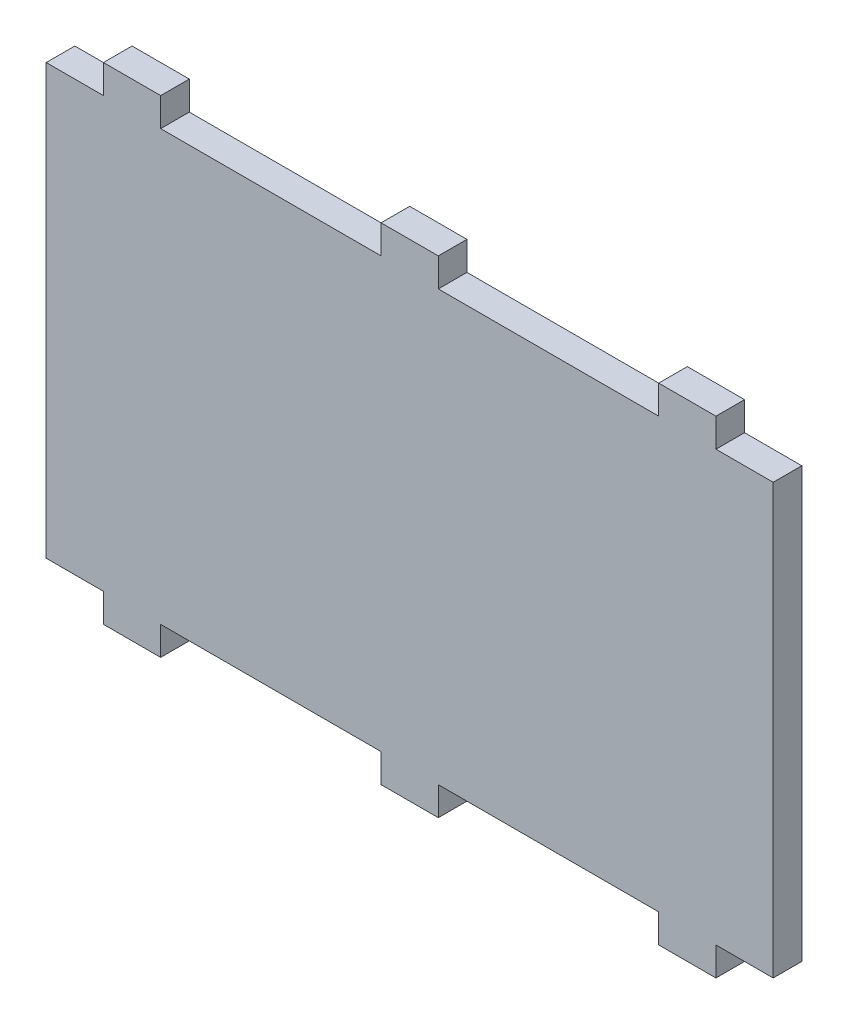
ISO-10303-21;
HEADER;
FILE_DESCRIPTION(('STEP AP214'),'2;1');
FILE_NAME('part.step','',(''),(''),'','','');
FILE_SCHEMA(('AUTOMOTIVE_DESIGN { 1 0 10303 214 1 1 1 1 }'));
ENDSEC;
DATA;
#1=APPLICATION_CONTEXT('core data for automotive mechanical design processes');
#2=APPLICATION_PROTOCOL_DEFINITION('international standard','automotive_design',2000,#1);
#3=PRODUCT_CONTEXT('',#1,'mechanical');
#4=PRODUCT('Part','Part','',(#3));
#5=PRODUCT_RELATED_PRODUCT_CATEGORY('part','',(#4));
#6=PRODUCT_DEFINITION_FORMATION('','',#4);
#7=PRODUCT_DEFINITION_CONTEXT('part definition',#1,'design');
#8=PRODUCT_DEFINITION('design','',#6,#7);
#9=PRODUCT_DEFINITION_SHAPE('','',#8);
#10=(LENGTH_UNIT() NAMED_UNIT(*) SI_UNIT(.MILLI.,.METRE.));
#11=(NAMED_UNIT(*) PLANE_ANGLE_UNIT() SI_UNIT($,.RADIAN.));
#12=(NAMED_UNIT(*) SI_UNIT($,.STERADIAN.) SOLID_ANGLE_UNIT());
#13=UNCERTAINTY_MEASURE_WITH_UNIT(LENGTH_MEASURE(1.E-05),#10,'distance_accuracy_value','');
#14=(GEOMETRIC_REPRESENTATION_CONTEXT(3) GLOBAL_UNCERTAINTY_ASSIGNED_CONTEXT((#13)) GLOBAL_UNIT_ASSIGNED_CONTEXT((#10,
#11,#12)) REPRESENTATION_CONTEXT('',''));
#15=CARTESIAN_POINT('',(0.,0.,0.));
#16=DIRECTION('',(0.,0.,1.));
#17=DIRECTION('',(1.,0.,0.));
#18=AXIS2_PLACEMENT_3D('',#15,#16,#17);
#19=CARTESIAN_POINT('',(0.,0.,5.));
#20=DIRECTION('',(0.,1.,0.));
#21=DIRECTION('',(0.,0.,1.));
#22=AXIS2_PLACEMENT_3D('',#19,#20,#21);
#23=PLANE('',#22);
#24=DIRECTION('',(1.,0.,0.));
#25=VECTOR('',#24,1.);
#26=CARTESIAN_POINT('',(0.,0.,0.));
#27=LINE('',#26,#25);
#28=CARTESIAN_POINT('',(68.5,0.,0.));
#29=VERTEX_POINT('',#28);
#30=CARTESIAN_POINT('',(107.,0.,0.));
#31=VERTEX_POINT('',#30);
#32=EDGE_CURVE('E320',#29,#31,#27,.T.);
#33=ORIENTED_EDGE('',*,*,#32,.T.);
#34=DIRECTION('',(0.,0.,1.));
#35=VECTOR('',#34,1.);
#36=CARTESIAN_POINT('',(107.,0.,0.));
#37=LINE('',#36,#35);
#38=CARTESIAN_POINT('',(107.,0.,5.));
#39=VERTEX_POINT('',#38);
#40=EDGE_CURVE('E58',#31,#39,#37,.T.);
#41=ORIENTED_EDGE('',*,*,#40,.T.);
#42=DIRECTION('',(1.,0.,0.));
#43=VECTOR('',#42,1.);
#44=CARTESIAN_POINT('',(0.,0.,5.));
#45=LINE('',#44,#43);
#46=CARTESIAN_POINT('',(68.5,0.,5.));
#47=VERTEX_POINT('',#46);
#48=EDGE_CURVE('E325',#47,#39,#45,.T.);
#49=ORIENTED_EDGE('',*,*,#48,.F.);
#50=DIRECTION('',(0.,0.,1.));
#51=VECTOR('',#50,1.);
#52=CARTESIAN_POINT('',(68.5,0.,0.));
#53=LINE('',#52,#51);
#54=EDGE_CURVE('E278',#29,#47,#53,.T.);
#55=ORIENTED_EDGE('',*,*,#54,.F.);
#56=EDGE_LOOP('',(#33,#41,#49,#55));
#57=FACE_BOUND('',#56,.T.);
#58=ADVANCED_FACE('F33',(#57),#23,.F.);
#59=CARTESIAN_POINT('',(20.,0.,0.));
#60=VERTEX_POINT('',#59);
#61=CARTESIAN_POINT('',(58.5,0.,0.));
#62=VERTEX_POINT('',#61);
#63=EDGE_CURVE('E323',#60,#62,#27,.T.);
#64=ORIENTED_EDGE('',*,*,#63,.T.);
#65=DIRECTION('',(0.,0.,1.));
#66=VECTOR('',#65,1.);
#67=CARTESIAN_POINT('',(58.5,0.,0.));
#68=LINE('',#67,#66);
#69=CARTESIAN_POINT('',(58.5,0.,5.));
#70=VERTEX_POINT('',#69);
#71=EDGE_CURVE('E275',#62,#70,#68,.T.);
#72=ORIENTED_EDGE('',*,*,#71,.T.);
#73=CARTESIAN_POINT('',(20.,0.,5.));
#74=VERTEX_POINT('',#73);
#75=EDGE_CURVE('E737',#74,#70,#45,.T.);
#76=ORIENTED_EDGE('',*,*,#75,.F.);
#77=DIRECTION('',(0.,0.,1.));
#78=VECTOR('',#77,1.);
#79=CARTESIAN_POINT('',(20.,0.,0.));
#80=LINE('',#79,#78);
#81=EDGE_CURVE('E303',#60,#74,#80,.T.);
#82=ORIENTED_EDGE('',*,*,#81,.F.);
#83=EDGE_LOOP('',(#64,#72,#76,#82));
#84=FACE_BOUND('',#83,.T.);
#85=ADVANCED_FACE('F496',(#84),#23,.F.);
#86=CARTESIAN_POINT('',(117.,0.,5.));
#87=VERTEX_POINT('',#86);
#88=CARTESIAN_POINT('',(127.,0.,5.));
#89=VERTEX_POINT('',#88);
#90=EDGE_CURVE('E37',#87,#89,#45,.T.);
#91=ORIENTED_EDGE('',*,*,#90,.F.);
#92=DIRECTION('',(0.,0.,1.));
#93=VECTOR('',#92,1.);
#94=CARTESIAN_POINT('',(117.,0.,0.));
#95=LINE('',#94,#93);
#96=CARTESIAN_POINT('',(117.,0.,0.));
#97=VERTEX_POINT('',#96);
#98=EDGE_CURVE('E254',#97,#87,#95,.T.);
#99=ORIENTED_EDGE('',*,*,#98,.F.);
#100=CARTESIAN_POINT('',(127.,0.,0.));
#101=VERTEX_POINT('',#100);
#102=EDGE_CURVE('E324',#97,#101,#27,.T.);
#103=ORIENTED_EDGE('',*,*,#102,.T.);
#104=DIRECTION('',(0.,0.,-1.));
#105=VECTOR('',#104,1.);
#106=CARTESIAN_POINT('',(127.,0.,5.));
#107=LINE('',#106,#105);
#108=EDGE_CURVE('E43',#89,#101,#107,.T.);
#109=ORIENTED_EDGE('',*,*,#108,.F.);
#110=EDGE_LOOP('',(#91,#99,#103,#109));
#111=FACE_BOUND('',#110,.T.);
#112=ADVANCED_FACE('F491',(#111),#23,.F.);
#113=CARTESIAN_POINT('',(0.,75.,5.));
#114=DIRECTION('',(0.,-1.,0.));
#115=DIRECTION('',(0.,0.,-1.));
#116=AXIS2_PLACEMENT_3D('',#113,#114,#115);
#117=PLANE('',#116);
#118=DIRECTION('',(-1.,0.,0.));
#119=VECTOR('',#118,1.);
#120=CARTESIAN_POINT('',(0.,75.,5.));
#121=LINE('',#120,#119);
#122=CARTESIAN_POINT('',(58.5,75.,5.));
#123=VERTEX_POINT('',#122);
#124=CARTESIAN_POINT('',(20.,75.,5.));
#125=VERTEX_POINT('',#124);
#126=EDGE_CURVE('E342',#123,#125,#121,.T.);
#127=ORIENTED_EDGE('',*,*,#126,.F.);
#128=DIRECTION('',(0.,0.,1.));
#129=VECTOR('',#128,1.);
#130=CARTESIAN_POINT('',(58.5,75.,0.));
#131=LINE('',#130,#129);
#132=CARTESIAN_POINT('',(58.5,75.,0.));
#133=VERTEX_POINT('',#132);
#134=EDGE_CURVE('E766',#133,#123,#131,.T.);
#135=ORIENTED_EDGE('',*,*,#134,.F.);
#136=DIRECTION('',(-1.,0.,0.));
#137=VECTOR('',#136,1.);
#138=CARTESIAN_POINT('',(0.,75.,0.));
#139=LINE('',#138,#137);
#140=CARTESIAN_POINT('',(20.,75.,0.));
#141=VERTEX_POINT('',#140);
#142=EDGE_CURVE('E346',#133,#141,#139,.T.);
#143=ORIENTED_EDGE('',*,*,#142,.T.);
#144=DIRECTION('',(0.,0.,1.));
#145=VECTOR('',#144,1.);
#146=CARTESIAN_POINT('',(20.,75.,0.));
#147=LINE('',#146,#145);
#148=EDGE_CURVE('E442',#141,#125,#147,.T.);
#149=ORIENTED_EDGE('',*,*,#148,.T.);
#150=EDGE_LOOP('',(#127,#135,#143,#149));
#151=FACE_BOUND('',#150,.T.);
#152=ADVANCED_FACE('F484',(#151),#117,.F.);
#153=CARTESIAN_POINT('',(127.,75.,0.));
#154=VERTEX_POINT('',#153);
#155=CARTESIAN_POINT('',(117.,75.,0.));
#156=VERTEX_POINT('',#155);
#157=EDGE_CURVE('E363',#154,#156,#139,.T.);
#158=ORIENTED_EDGE('',*,*,#157,.T.);
#159=DIRECTION('',(0.,0.,1.));
#160=VECTOR('',#159,1.);
#161=CARTESIAN_POINT('',(117.,75.,0.));
#162=LINE('',#161,#160);
#163=CARTESIAN_POINT('',(117.,75.,5.));
#164=VERTEX_POINT('',#163);
#165=EDGE_CURVE('E402',#156,#164,#162,.T.);
#166=ORIENTED_EDGE('',*,*,#165,.T.);
#167=CARTESIAN_POINT('',(127.,75.,5.));
#168=VERTEX_POINT('',#167);
#169=EDGE_CURVE('E357',#168,#164,#121,.T.);
#170=ORIENTED_EDGE('',*,*,#169,.F.);
#171=DIRECTION('',(0.,0.,-1.));
#172=VECTOR('',#171,1.);
#173=CARTESIAN_POINT('',(127.,75.,5.));
#174=LINE('',#173,#172);
#175=EDGE_CURVE('E378',#168,#154,#174,.T.);
#176=ORIENTED_EDGE('',*,*,#175,.T.);
#177=EDGE_LOOP('',(#158,#166,#170,#176));
#178=FACE_BOUND('',#177,.T.);
#179=ADVANCED_FACE('F482',(#178),#117,.F.);
#180=DIRECTION('',(0.,0.,1.));
#181=VECTOR('',#180,1.);
#182=CARTESIAN_POINT('',(9.99999999999999,75.,0.));
#183=LINE('',#182,#181);
#184=CARTESIAN_POINT('',(9.99999999999999,75.,0.));
#185=VERTEX_POINT('',#184);
#186=CARTESIAN_POINT('',(9.99999999999999,75.,5.));
#187=VERTEX_POINT('',#186);
#188=EDGE_CURVE('E431',#185,#187,#183,.T.);
#189=ORIENTED_EDGE('',*,*,#188,.F.);
#190=CARTESIAN_POINT('',(0.,75.,0.));
#191=VERTEX_POINT('',#190);
#192=EDGE_CURVE('E372',#185,#191,#139,.T.);
#193=ORIENTED_EDGE('',*,*,#192,.T.);
#194=DIRECTION('',(0.,0.,-1.));
#195=VECTOR('',#194,1.);
#196=CARTESIAN_POINT('',(0.,75.,5.));
#197=LINE('',#196,#195);
#198=CARTESIAN_POINT('',(0.,75.,5.));
#199=VERTEX_POINT('',#198);
#200=EDGE_CURVE('E368',#199,#191,#197,.T.);
#201=ORIENTED_EDGE('',*,*,#200,.F.);
#202=EDGE_CURVE('E345',#187,#199,#121,.T.);
#203=ORIENTED_EDGE('',*,*,#202,.F.);
#204=EDGE_LOOP('',(#189,#193,#201,#203));
#205=FACE_BOUND('',#204,.T.);
#206=ADVANCED_FACE('F477',(#205),#117,.F.);
#207=CARTESIAN_POINT('',(0.,0.,5.));
#208=DIRECTION('',(1.,0.,0.));
#209=DIRECTION('',(0.,0.,-1.));
#210=AXIS2_PLACEMENT_3D('',#207,#208,#209);
#211=PLANE('',#210);
#212=DIRECTION('',(0.,-1.,0.));
#213=VECTOR('',#212,1.);
#214=CARTESIAN_POINT('',(0.,0.,0.));
#215=LINE('',#214,#213);
#216=CARTESIAN_POINT('',(0.,0.,0.));
#217=VERTEX_POINT('',#216);
#218=EDGE_CURVE('E329',#191,#217,#215,.T.);
#219=ORIENTED_EDGE('',*,*,#218,.T.);
#220=DIRECTION('',(0.,0.,-1.));
#221=VECTOR('',#220,1.);
#222=CARTESIAN_POINT('',(0.,0.,5.));
#223=LINE('',#222,#221);
#224=CARTESIAN_POINT('',(0.,0.,5.));
#225=VERTEX_POINT('',#224);
#226=EDGE_CURVE('E11',#225,#217,#223,.T.);
#227=ORIENTED_EDGE('',*,*,#226,.F.);
#228=DIRECTION('',(0.,-1.,0.));
#229=VECTOR('',#228,1.);
#230=CARTESIAN_POINT('',(0.,0.,5.));
#231=LINE('',#230,#229);
#232=EDGE_CURVE('E375',#199,#225,#231,.T.);
#233=ORIENTED_EDGE('',*,*,#232,.F.);
#234=ORIENTED_EDGE('',*,*,#200,.T.);
#235=EDGE_LOOP('',(#219,#227,#233,#234));
#236=FACE_BOUND('',#235,.T.);
#237=ADVANCED_FACE('F35',(#236),#211,.F.);
#238=CARTESIAN_POINT('',(10.,0.,0.));
#239=VERTEX_POINT('',#238);
#240=EDGE_CURVE('E339',#217,#239,#27,.T.);
#241=ORIENTED_EDGE('',*,*,#240,.T.);
#242=DIRECTION('',(0.,0.,1.));
#243=VECTOR('',#242,1.);
#244=CARTESIAN_POINT('',(10.,0.,0.));
#245=LINE('',#244,#243);
#246=CARTESIAN_POINT('',(10.,0.,5.));
#247=VERTEX_POINT('',#246);
#248=EDGE_CURVE('E298',#239,#247,#245,.T.);
#249=ORIENTED_EDGE('',*,*,#248,.T.);
#250=EDGE_CURVE('E739',#225,#247,#45,.T.);
#251=ORIENTED_EDGE('',*,*,#250,.F.);
#252=ORIENTED_EDGE('',*,*,#226,.T.);
#253=EDGE_LOOP('',(#241,#249,#251,#252));
#254=FACE_BOUND('',#253,.T.);
#255=ADVANCED_FACE('F497',(#254),#23,.F.);
#256=CARTESIAN_POINT('',(127.,0.,5.));
#257=DIRECTION('',(-1.,0.,0.));
#258=DIRECTION('',(0.,0.,1.));
#259=AXIS2_PLACEMENT_3D('',#256,#257,#258);
#260=PLANE('',#259);
#261=DIRECTION('',(0.,1.,0.));
#262=VECTOR('',#261,1.);
#263=CARTESIAN_POINT('',(127.,0.,0.));
#264=LINE('',#263,#262);
#265=EDGE_CURVE('E331',#101,#154,#264,.T.);
#266=ORIENTED_EDGE('',*,*,#265,.T.);
#267=ORIENTED_EDGE('',*,*,#175,.F.);
#268=DIRECTION('',(0.,1.,0.));
#269=VECTOR('',#268,1.);
#270=CARTESIAN_POINT('',(127.,0.,5.));
#271=LINE('',#270,#269);
#272=EDGE_CURVE('E350',#89,#168,#271,.T.);
#273=ORIENTED_EDGE('',*,*,#272,.F.);
#274=ORIENTED_EDGE('',*,*,#108,.T.);
#275=EDGE_LOOP('',(#266,#267,#273,#274));
#276=FACE_BOUND('',#275,.T.);
#277=ADVANCED_FACE('F480',(#276),#260,.F.);
#278=CARTESIAN_POINT('',(107.,75.,0.));
#279=VERTEX_POINT('',#278);
#280=CARTESIAN_POINT('',(68.5,75.,0.));
#281=VERTEX_POINT('',#280);
#282=EDGE_CURVE('E361',#279,#281,#139,.T.);
#283=ORIENTED_EDGE('',*,*,#282,.T.);
#284=DIRECTION('',(0.,0.,1.));
#285=VECTOR('',#284,1.);
#286=CARTESIAN_POINT('',(68.5,75.,0.));
#287=LINE('',#286,#285);
#288=CARTESIAN_POINT('',(68.5,75.,5.));
#289=VERTEX_POINT('',#288);
#290=EDGE_CURVE('E774',#281,#289,#287,.T.);
#291=ORIENTED_EDGE('',*,*,#290,.T.);
#292=CARTESIAN_POINT('',(107.,75.,5.));
#293=VERTEX_POINT('',#292);
#294=EDGE_CURVE('E344',#293,#289,#121,.T.);
#295=ORIENTED_EDGE('',*,*,#294,.F.);
#296=DIRECTION('',(0.,0.,1.));
#297=VECTOR('',#296,1.);
#298=CARTESIAN_POINT('',(107.,75.,0.));
#299=LINE('',#298,#297);
#300=EDGE_CURVE('E422',#279,#293,#299,.T.);
#301=ORIENTED_EDGE('',*,*,#300,.F.);
#302=EDGE_LOOP('',(#283,#291,#295,#301));
#303=FACE_BOUND('',#302,.T.);
#304=ADVANCED_FACE('F490',(#303),#117,.F.);
#305=CARTESIAN_POINT('',(0.,0.,5.));
#306=DIRECTION('',(0.,0.,-1.));
#307=DIRECTION('',(-1.,0.,0.));
#308=AXIS2_PLACEMENT_3D('',#305,#306,#307);
#309=PLANE('',#308);
#310=ORIENTED_EDGE('',*,*,#232,.T.);
#311=ORIENTED_EDGE('',*,*,#250,.T.);
#312=DIRECTION('',(0.,-1.,0.));
#313=VECTOR('',#312,1.);
#314=CARTESIAN_POINT('',(10.,0.,5.));
#315=LINE('',#314,#313);
#316=CARTESIAN_POINT('',(10.,-5.,5.));
#317=VERTEX_POINT('',#316);
#318=EDGE_CURVE('E277',#247,#317,#315,.T.);
#319=ORIENTED_EDGE('',*,*,#318,.T.);
#320=DIRECTION('',(1.,0.,0.));
#321=VECTOR('',#320,1.);
#322=CARTESIAN_POINT('',(10.,-5.,5.));
#323=LINE('',#322,#321);
#324=CARTESIAN_POINT('',(20.,-5.,5.));
#325=VERTEX_POINT('',#324);
#326=EDGE_CURVE('E289',#317,#325,#323,.T.);
#327=ORIENTED_EDGE('',*,*,#326,.T.);
#328=DIRECTION('',(0.,1.,0.));
#329=VECTOR('',#328,1.);
#330=CARTESIAN_POINT('',(20.,0.,5.));
#331=LINE('',#330,#329);
#332=EDGE_CURVE('E292',#325,#74,#331,.T.);
#333=ORIENTED_EDGE('',*,*,#332,.T.);
#334=ORIENTED_EDGE('',*,*,#75,.T.);
#335=DIRECTION('',(0.,-1.,0.));
#336=VECTOR('',#335,1.);
#337=CARTESIAN_POINT('',(58.5,0.,5.));
#338=LINE('',#337,#336);
#339=CARTESIAN_POINT('',(58.5,-5.,5.));
#340=VERTEX_POINT('',#339);
#341=EDGE_CURVE('E253',#70,#340,#338,.T.);
#342=ORIENTED_EDGE('',*,*,#341,.T.);
#343=DIRECTION('',(1.,0.,0.));
#344=VECTOR('',#343,1.);
#345=CARTESIAN_POINT('',(58.5,-5.,5.));
#346=LINE('',#345,#344);
#347=CARTESIAN_POINT('',(68.5,-5.,5.));
#348=VERTEX_POINT('',#347);
#349=EDGE_CURVE('E270',#340,#348,#346,.T.);
#350=ORIENTED_EDGE('',*,*,#349,.T.);
#351=DIRECTION('',(0.,1.,0.));
#352=VECTOR('',#351,1.);
#353=CARTESIAN_POINT('',(68.5,0.,5.));
#354=LINE('',#353,#352);
#355=EDGE_CURVE('E261',#348,#47,#354,.T.);
#356=ORIENTED_EDGE('',*,*,#355,.T.);
#357=ORIENTED_EDGE('',*,*,#48,.T.);
#358=DIRECTION('',(0.,-1.,0.));
#359=VECTOR('',#358,1.);
#360=CARTESIAN_POINT('',(107.,0.,5.));
#361=LINE('',#360,#359);
#362=CARTESIAN_POINT('',(107.,-5.00000000000001,5.));
#363=VERTEX_POINT('',#362);
#364=EDGE_CURVE('E249',#39,#363,#361,.T.);
#365=ORIENTED_EDGE('',*,*,#364,.T.);
#366=DIRECTION('',(1.,0.,0.));
#367=VECTOR('',#366,1.);
#368=CARTESIAN_POINT('',(107.,-5.00000000000001,5.));
#369=LINE('',#368,#367);
#370=CARTESIAN_POINT('',(117.,-5.00000000000001,5.));
#371=VERTEX_POINT('',#370);
#372=EDGE_CURVE('E226',#363,#371,#369,.T.);
#373=ORIENTED_EDGE('',*,*,#372,.T.);
#374=DIRECTION('',(0.,1.,0.));
#375=VECTOR('',#374,1.);
#376=CARTESIAN_POINT('',(117.,0.,5.));
#377=LINE('',#376,#375);
#378=EDGE_CURVE('E243',#371,#87,#377,.T.);
#379=ORIENTED_EDGE('',*,*,#378,.T.);
#380=ORIENTED_EDGE('',*,*,#90,.T.);
#381=ORIENTED_EDGE('',*,*,#272,.T.);
#382=ORIENTED_EDGE('',*,*,#169,.T.);
#383=DIRECTION('',(0.,1.,0.));
#384=VECTOR('',#383,1.);
#385=CARTESIAN_POINT('',(117.,75.,5.));
#386=LINE('',#385,#384);
#387=CARTESIAN_POINT('',(117.,80.,5.));
#388=VERTEX_POINT('',#387);
#389=EDGE_CURVE('E396',#164,#388,#386,.T.);
#390=ORIENTED_EDGE('',*,*,#389,.T.);
#391=DIRECTION('',(-1.,0.,0.));
#392=VECTOR('',#391,1.);
#393=CARTESIAN_POINT('',(117.,80.,5.));
#394=LINE('',#393,#392);
#395=CARTESIAN_POINT('',(107.,80.,5.));
#396=VERTEX_POINT('',#395);
#397=EDGE_CURVE('E406',#388,#396,#394,.T.);
#398=ORIENTED_EDGE('',*,*,#397,.T.);
#399=DIRECTION('',(0.,-1.,0.));
#400=VECTOR('',#399,1.);
#401=CARTESIAN_POINT('',(107.,75.,5.));
#402=LINE('',#401,#400);
#403=EDGE_CURVE('E409',#396,#293,#402,.T.);
#404=ORIENTED_EDGE('',*,*,#403,.T.);
#405=ORIENTED_EDGE('',*,*,#294,.T.);
#406=DIRECTION('',(0.,1.,0.));
#407=VECTOR('',#406,1.);
#408=CARTESIAN_POINT('',(68.5,75.,5.));
#409=LINE('',#408,#407);
#410=CARTESIAN_POINT('',(68.5,80.,5.));
#411=VERTEX_POINT('',#410);
#412=EDGE_CURVE('E768',#289,#411,#409,.T.);
#413=ORIENTED_EDGE('',*,*,#412,.T.);
#414=DIRECTION('',(-1.,0.,0.));
#415=VECTOR('',#414,1.);
#416=CARTESIAN_POINT('',(58.5,80.,5.));
#417=LINE('',#416,#415);
#418=CARTESIAN_POINT('',(58.5,80.,5.));
#419=VERTEX_POINT('',#418);
#420=EDGE_CURVE('E760',#411,#419,#417,.T.);
#421=ORIENTED_EDGE('',*,*,#420,.T.);
#422=DIRECTION('',(0.,-1.,0.));
#423=VECTOR('',#422,1.);
#424=CARTESIAN_POINT('',(58.5,75.,5.));
#425=LINE('',#424,#423);
#426=EDGE_CURVE('E302',#419,#123,#425,.T.);
#427=ORIENTED_EDGE('',*,*,#426,.T.);
#428=ORIENTED_EDGE('',*,*,#126,.T.);
#429=DIRECTION('',(0.,1.,0.));
#430=VECTOR('',#429,1.);
#431=CARTESIAN_POINT('',(20.,75.,5.));
#432=LINE('',#431,#430);
#433=CARTESIAN_POINT('',(20.,80.,5.));
#434=VERTEX_POINT('',#433);
#435=EDGE_CURVE('E437',#125,#434,#432,.T.);
#436=ORIENTED_EDGE('',*,*,#435,.T.);
#437=DIRECTION('',(-1.,0.,0.));
#438=VECTOR('',#437,1.);
#439=CARTESIAN_POINT('',(10.,80.,5.));
#440=LINE('',#439,#438);
#441=CARTESIAN_POINT('',(10.,80.,5.));
#442=VERTEX_POINT('',#441);
#443=EDGE_CURVE('E433',#434,#442,#440,.T.);
#444=ORIENTED_EDGE('',*,*,#443,.T.);
#445=DIRECTION('',(0.,-1.,0.));
#446=VECTOR('',#445,1.);
#447=CARTESIAN_POINT('',(9.99999999999999,75.,5.));
#448=LINE('',#447,#446);
#449=EDGE_CURVE('E421',#442,#187,#448,.T.);
#450=ORIENTED_EDGE('',*,*,#449,.T.);
#451=ORIENTED_EDGE('',*,*,#202,.T.);
#452=EDGE_LOOP('',(#310,#311,#319,#327,#333,#334,#342,#350,#356,#357,#365,#373,#379,#380,#381,
#382,#390,#398,#404,#405,#413,#421,#427,#428,#436,#444,#450,#451));
#453=FACE_BOUND('',#452,.T.);
#454=ADVANCED_FACE('F394',(#453),#309,.F.);
#455=CARTESIAN_POINT('',(0.,0.,0.));
#456=DIRECTION('',(0.,0.,-1.));
#457=DIRECTION('',(-1.,0.,0.));
#458=AXIS2_PLACEMENT_3D('',#455,#456,#457);
#459=PLANE('',#458);
#460=ORIENTED_EDGE('',*,*,#218,.F.);
#461=ORIENTED_EDGE('',*,*,#192,.F.);
#462=DIRECTION('',(0.,-1.,0.));
#463=VECTOR('',#462,1.);
#464=CARTESIAN_POINT('',(9.99999999999999,75.,0.));
#465=LINE('',#464,#463);
#466=CARTESIAN_POINT('',(10.,80.,0.));
#467=VERTEX_POINT('',#466);
#468=EDGE_CURVE('E436',#467,#185,#465,.T.);
#469=ORIENTED_EDGE('',*,*,#468,.F.);
#470=DIRECTION('',(-1.,0.,0.));
#471=VECTOR('',#470,1.);
#472=CARTESIAN_POINT('',(10.,80.,0.));
#473=LINE('',#472,#471);
#474=CARTESIAN_POINT('',(20.,80.,0.));
#475=VERTEX_POINT('',#474);
#476=EDGE_CURVE('E428',#475,#467,#473,.T.);
#477=ORIENTED_EDGE('',*,*,#476,.F.);
#478=DIRECTION('',(0.,1.,0.));
#479=VECTOR('',#478,1.);
#480=CARTESIAN_POINT('',(20.,75.,0.));
#481=LINE('',#480,#479);
#482=EDGE_CURVE('E432',#141,#475,#481,.T.);
#483=ORIENTED_EDGE('',*,*,#482,.F.);
#484=ORIENTED_EDGE('',*,*,#142,.F.);
#485=DIRECTION('',(0.,-1.,0.));
#486=VECTOR('',#485,1.);
#487=CARTESIAN_POINT('',(58.5,75.,0.));
#488=LINE('',#487,#486);
#489=CARTESIAN_POINT('',(58.5,80.,0.));
#490=VERTEX_POINT('',#489);
#491=EDGE_CURVE('E756',#490,#133,#488,.T.);
#492=ORIENTED_EDGE('',*,*,#491,.F.);
#493=DIRECTION('',(-1.,0.,0.));
#494=VECTOR('',#493,1.);
#495=CARTESIAN_POINT('',(58.5,80.,0.));
#496=LINE('',#495,#494);
#497=CARTESIAN_POINT('',(68.5,80.,0.));
#498=VERTEX_POINT('',#497);
#499=EDGE_CURVE('E763',#498,#490,#496,.T.);
#500=ORIENTED_EDGE('',*,*,#499,.F.);
#501=DIRECTION('',(0.,1.,0.));
#502=VECTOR('',#501,1.);
#503=CARTESIAN_POINT('',(68.5,75.,0.));
#504=LINE('',#503,#502);
#505=EDGE_CURVE('E759',#281,#498,#504,.T.);
#506=ORIENTED_EDGE('',*,*,#505,.F.);
#507=ORIENTED_EDGE('',*,*,#282,.F.);
#508=DIRECTION('',(0.,-1.,0.));
#509=VECTOR('',#508,1.);
#510=CARTESIAN_POINT('',(107.,75.,0.));
#511=LINE('',#510,#509);
#512=CARTESIAN_POINT('',(107.,80.,0.));
#513=VERTEX_POINT('',#512);
#514=EDGE_CURVE('E414',#513,#279,#511,.T.);
#515=ORIENTED_EDGE('',*,*,#514,.F.);
#516=DIRECTION('',(-1.,0.,0.));
#517=VECTOR('',#516,1.);
#518=CARTESIAN_POINT('',(117.,80.,0.));
#519=LINE('',#518,#517);
#520=CARTESIAN_POINT('',(117.,80.,0.));
#521=VERTEX_POINT('',#520);
#522=EDGE_CURVE('E778',#521,#513,#519,.T.);
#523=ORIENTED_EDGE('',*,*,#522,.F.);
#524=DIRECTION('',(0.,1.,0.));
#525=VECTOR('',#524,1.);
#526=CARTESIAN_POINT('',(117.,75.,0.));
#527=LINE('',#526,#525);
#528=EDGE_CURVE('E419',#156,#521,#527,.T.);
#529=ORIENTED_EDGE('',*,*,#528,.F.);
#530=ORIENTED_EDGE('',*,*,#157,.F.);
#531=ORIENTED_EDGE('',*,*,#265,.F.);
#532=ORIENTED_EDGE('',*,*,#102,.F.);
#533=DIRECTION('',(0.,1.,0.));
#534=VECTOR('',#533,1.);
#535=CARTESIAN_POINT('',(117.,0.,0.));
#536=LINE('',#535,#534);
#537=CARTESIAN_POINT('',(117.,-5.00000000000001,0.));
#538=VERTEX_POINT('',#537);
#539=EDGE_CURVE('E232',#538,#97,#536,.T.);
#540=ORIENTED_EDGE('',*,*,#539,.F.);
#541=DIRECTION('',(1.,0.,0.));
#542=VECTOR('',#541,1.);
#543=CARTESIAN_POINT('',(107.,-5.00000000000001,0.));
#544=LINE('',#543,#542);
#545=CARTESIAN_POINT('',(107.,-5.00000000000001,0.));
#546=VERTEX_POINT('',#545);
#547=EDGE_CURVE('E224',#546,#538,#544,.T.);
#548=ORIENTED_EDGE('',*,*,#547,.F.);
#549=DIRECTION('',(0.,-1.,0.));
#550=VECTOR('',#549,1.);
#551=CARTESIAN_POINT('',(107.,0.,0.));
#552=LINE('',#551,#550);
#553=EDGE_CURVE('E239',#31,#546,#552,.T.);
#554=ORIENTED_EDGE('',*,*,#553,.F.);
#555=ORIENTED_EDGE('',*,*,#32,.F.);
#556=DIRECTION('',(0.,1.,0.));
#557=VECTOR('',#556,1.);
#558=CARTESIAN_POINT('',(68.5,0.,0.));
#559=LINE('',#558,#557);
#560=CARTESIAN_POINT('',(68.5,-5.,0.));
#561=VERTEX_POINT('',#560);
#562=EDGE_CURVE('E264',#561,#29,#559,.T.);
#563=ORIENTED_EDGE('',*,*,#562,.F.);
#564=DIRECTION('',(1.,0.,0.));
#565=VECTOR('',#564,1.);
#566=CARTESIAN_POINT('',(58.5,-5.,0.));
#567=LINE('',#566,#565);
#568=CARTESIAN_POINT('',(58.5,-5.,0.));
#569=VERTEX_POINT('',#568);
#570=EDGE_CURVE('E260',#569,#561,#567,.T.);
#571=ORIENTED_EDGE('',*,*,#570,.F.);
#572=DIRECTION('',(0.,-1.,0.));
#573=VECTOR('',#572,1.);
#574=CARTESIAN_POINT('',(58.5,0.,0.));
#575=LINE('',#574,#573);
#576=EDGE_CURVE('E257',#62,#569,#575,.T.);
#577=ORIENTED_EDGE('',*,*,#576,.F.);
#578=ORIENTED_EDGE('',*,*,#63,.F.);
#579=DIRECTION('',(0.,1.,0.));
#580=VECTOR('',#579,1.);
#581=CARTESIAN_POINT('',(20.,0.,0.));
#582=LINE('',#581,#580);
#583=CARTESIAN_POINT('',(20.,-5.,0.));
#584=VERTEX_POINT('',#583);
#585=EDGE_CURVE('E287',#584,#60,#582,.T.);
#586=ORIENTED_EDGE('',*,*,#585,.F.);
#587=DIRECTION('',(1.,0.,0.));
#588=VECTOR('',#587,1.);
#589=CARTESIAN_POINT('',(10.,-5.,0.));
#590=LINE('',#589,#588);
#591=CARTESIAN_POINT('',(10.,-5.,0.));
#592=VERTEX_POINT('',#591);
#593=EDGE_CURVE('E284',#592,#584,#590,.T.);
#594=ORIENTED_EDGE('',*,*,#593,.F.);
#595=DIRECTION('',(0.,-1.,0.));
#596=VECTOR('',#595,1.);
#597=CARTESIAN_POINT('',(10.,0.,0.));
#598=LINE('',#597,#596);
#599=EDGE_CURVE('E288',#239,#592,#598,.T.);
#600=ORIENTED_EDGE('',*,*,#599,.F.);
#601=ORIENTED_EDGE('',*,*,#240,.F.);
#602=EDGE_LOOP('',(#460,#461,#469,#477,#483,#484,#492,#500,#506,#507,#515,#523,#529,#530,#531,
#532,#540,#548,#554,#555,#563,#571,#577,#578,#586,#594,#600,#601));
#603=FACE_BOUND('',#602,.T.);
#604=ADVANCED_FACE('F238',(#603),#459,.T.);
#605=CARTESIAN_POINT('',(9.99999999999999,75.,0.));
#606=DIRECTION('',(-1.,0.,0.));
#607=DIRECTION('',(0.,-1.,0.));
#608=AXIS2_PLACEMENT_3D('',#605,#606,#607);
#609=PLANE('',#608);
#610=ORIENTED_EDGE('',*,*,#449,.F.);
#611=DIRECTION('',(0.,0.,1.));
#612=VECTOR('',#611,1.);
#613=CARTESIAN_POINT('',(10.,80.,0.));
#614=LINE('',#613,#612);
#615=EDGE_CURVE('E438',#467,#442,#614,.T.);
#616=ORIENTED_EDGE('',*,*,#615,.F.);
#617=ORIENTED_EDGE('',*,*,#468,.T.);
#618=ORIENTED_EDGE('',*,*,#188,.T.);
#619=EDGE_LOOP('',(#610,#616,#617,#618));
#620=FACE_BOUND('',#619,.T.);
#621=ADVANCED_FACE('F473',(#620),#609,.T.);
#622=CARTESIAN_POINT('',(10.,80.,0.));
#623=DIRECTION('',(0.,1.,0.));
#624=DIRECTION('',(0.,0.,1.));
#625=AXIS2_PLACEMENT_3D('',#622,#623,#624);
#626=PLANE('',#625);
#627=ORIENTED_EDGE('',*,*,#443,.F.);
#628=DIRECTION('',(0.,0.,1.));
#629=VECTOR('',#628,1.);
#630=CARTESIAN_POINT('',(20.,80.,0.));
#631=LINE('',#630,#629);
#632=EDGE_CURVE('E440',#475,#434,#631,.T.);
#633=ORIENTED_EDGE('',*,*,#632,.F.);
#634=ORIENTED_EDGE('',*,*,#476,.T.);
#635=ORIENTED_EDGE('',*,*,#615,.T.);
#636=EDGE_LOOP('',(#627,#633,#634,#635));
#637=FACE_BOUND('',#636,.T.);
#638=ADVANCED_FACE('F469',(#637),#626,.T.);
#639=CARTESIAN_POINT('',(20.,75.,0.));
#640=DIRECTION('',(1.,0.,0.));
#641=DIRECTION('',(0.,0.,-1.));
#642=AXIS2_PLACEMENT_3D('',#639,#640,#641);
#643=PLANE('',#642);
#644=ORIENTED_EDGE('',*,*,#435,.F.);
#645=ORIENTED_EDGE('',*,*,#148,.F.);
#646=ORIENTED_EDGE('',*,*,#482,.T.);
#647=ORIENTED_EDGE('',*,*,#632,.T.);
#648=EDGE_LOOP('',(#644,#645,#646,#647));
#649=FACE_BOUND('',#648,.T.);
#650=ADVANCED_FACE('F578',(#649),#643,.T.);
#651=CARTESIAN_POINT('',(117.,75.,0.));
#652=DIRECTION('',(1.,0.,0.));
#653=DIRECTION('',(0.,0.,-1.));
#654=AXIS2_PLACEMENT_3D('',#651,#652,#653);
#655=PLANE('',#654);
#656=ORIENTED_EDGE('',*,*,#389,.F.);
#657=ORIENTED_EDGE('',*,*,#165,.F.);
#658=ORIENTED_EDGE('',*,*,#528,.T.);
#659=DIRECTION('',(0.,0.,1.));
#660=VECTOR('',#659,1.);
#661=CARTESIAN_POINT('',(117.,80.,0.));
#662=LINE('',#661,#660);
#663=EDGE_CURVE('E404',#521,#388,#662,.T.);
#664=ORIENTED_EDGE('',*,*,#663,.T.);
#665=EDGE_LOOP('',(#656,#657,#658,#664));
#666=FACE_BOUND('',#665,.T.);
#667=ADVANCED_FACE('F400',(#666),#655,.T.);
#668=CARTESIAN_POINT('',(107.,75.,0.));
#669=DIRECTION('',(-1.,0.,0.));
#670=DIRECTION('',(0.,0.,1.));
#671=AXIS2_PLACEMENT_3D('',#668,#669,#670);
#672=PLANE('',#671);
#673=ORIENTED_EDGE('',*,*,#403,.F.);
#674=DIRECTION('',(0.,0.,1.));
#675=VECTOR('',#674,1.);
#676=CARTESIAN_POINT('',(107.,80.,0.));
#677=LINE('',#676,#675);
#678=EDGE_CURVE('E425',#513,#396,#677,.T.);
#679=ORIENTED_EDGE('',*,*,#678,.F.);
#680=ORIENTED_EDGE('',*,*,#514,.T.);
#681=ORIENTED_EDGE('',*,*,#300,.T.);
#682=EDGE_LOOP('',(#673,#679,#680,#681));
#683=FACE_BOUND('',#682,.T.);
#684=ADVANCED_FACE('F595',(#683),#672,.T.);
#685=CARTESIAN_POINT('',(117.,80.,0.));
#686=DIRECTION('',(0.,1.,0.));
#687=DIRECTION('',(0.,0.,1.));
#688=AXIS2_PLACEMENT_3D('',#685,#686,#687);
#689=PLANE('',#688);
#690=ORIENTED_EDGE('',*,*,#397,.F.);
#691=ORIENTED_EDGE('',*,*,#663,.F.);
#692=ORIENTED_EDGE('',*,*,#522,.T.);
#693=ORIENTED_EDGE('',*,*,#678,.T.);
#694=EDGE_LOOP('',(#690,#691,#692,#693));
#695=FACE_BOUND('',#694,.T.);
#696=ADVANCED_FACE('F604',(#695),#689,.T.);
#697=CARTESIAN_POINT('',(58.5,75.,0.));
#698=DIRECTION('',(-1.,0.,0.));
#699=DIRECTION('',(0.,0.,1.));
#700=AXIS2_PLACEMENT_3D('',#697,#698,#699);
#701=PLANE('',#700);
#702=ORIENTED_EDGE('',*,*,#426,.F.);
#703=DIRECTION('',(0.,0.,1.));
#704=VECTOR('',#703,1.);
#705=CARTESIAN_POINT('',(58.5,80.,0.));
#706=LINE('',#705,#704);
#707=EDGE_CURVE('E407',#490,#419,#706,.T.);
#708=ORIENTED_EDGE('',*,*,#707,.F.);
#709=ORIENTED_EDGE('',*,*,#491,.T.);
#710=ORIENTED_EDGE('',*,*,#134,.T.);
#711=EDGE_LOOP('',(#702,#708,#709,#710));
#712=FACE_BOUND('',#711,.T.);
#713=ADVANCED_FACE('F614',(#712),#701,.T.);
#714=CARTESIAN_POINT('',(58.5,80.,0.));
#715=DIRECTION('',(0.,1.,0.));
#716=DIRECTION('',(0.,0.,1.));
#717=AXIS2_PLACEMENT_3D('',#714,#715,#716);
#718=PLANE('',#717);
#719=ORIENTED_EDGE('',*,*,#420,.F.);
#720=DIRECTION('',(0.,0.,1.));
#721=VECTOR('',#720,1.);
#722=CARTESIAN_POINT('',(68.5,80.,0.));
#723=LINE('',#722,#721);
#724=EDGE_CURVE('E411',#498,#411,#723,.T.);
#725=ORIENTED_EDGE('',*,*,#724,.F.);
#726=ORIENTED_EDGE('',*,*,#499,.T.);
#727=ORIENTED_EDGE('',*,*,#707,.T.);
#728=EDGE_LOOP('',(#719,#725,#726,#727));
#729=FACE_BOUND('',#728,.T.);
#730=ADVANCED_FACE('F624',(#729),#718,.T.);
#731=CARTESIAN_POINT('',(68.5,75.,0.));
#732=DIRECTION('',(1.,0.,0.));
#733=DIRECTION('',(0.,0.,-1.));
#734=AXIS2_PLACEMENT_3D('',#731,#732,#733);
#735=PLANE('',#734);
#736=ORIENTED_EDGE('',*,*,#412,.F.);
#737=ORIENTED_EDGE('',*,*,#290,.F.);
#738=ORIENTED_EDGE('',*,*,#505,.T.);
#739=ORIENTED_EDGE('',*,*,#724,.T.);
#740=EDGE_LOOP('',(#736,#737,#738,#739));
#741=FACE_BOUND('',#740,.T.);
#742=ADVANCED_FACE('F634',(#741),#735,.T.);
#743=CARTESIAN_POINT('',(10.,0.,0.));
#744=DIRECTION('',(-1.,0.,0.));
#745=DIRECTION('',(0.,-1.,0.));
#746=AXIS2_PLACEMENT_3D('',#743,#744,#745);
#747=PLANE('',#746);
#748=ORIENTED_EDGE('',*,*,#318,.F.);
#749=ORIENTED_EDGE('',*,*,#248,.F.);
#750=ORIENTED_EDGE('',*,*,#599,.T.);
#751=DIRECTION('',(0.,0.,1.));
#752=VECTOR('',#751,1.);
#753=CARTESIAN_POINT('',(10.,-5.,0.));
#754=LINE('',#753,#752);
#755=EDGE_CURVE('E313',#592,#317,#754,.T.);
#756=ORIENTED_EDGE('',*,*,#755,.T.);
#757=EDGE_LOOP('',(#748,#749,#750,#756));
#758=FACE_BOUND('',#757,.T.);
#759=ADVANCED_FACE('F644',(#758),#747,.T.);
#760=CARTESIAN_POINT('',(20.,0.,0.));
#761=DIRECTION('',(1.,0.,0.));
#762=DIRECTION('',(0.,0.,-1.));
#763=AXIS2_PLACEMENT_3D('',#760,#761,#762);
#764=PLANE('',#763);
#765=ORIENTED_EDGE('',*,*,#332,.F.);
#766=DIRECTION('',(0.,0.,1.));
#767=VECTOR('',#766,1.);
#768=CARTESIAN_POINT('',(20.,-5.,0.));
#769=LINE('',#768,#767);
#770=EDGE_CURVE('E311',#584,#325,#769,.T.);
#771=ORIENTED_EDGE('',*,*,#770,.F.);
#772=ORIENTED_EDGE('',*,*,#585,.T.);
#773=ORIENTED_EDGE('',*,*,#81,.T.);
#774=EDGE_LOOP('',(#765,#771,#772,#773));
#775=FACE_BOUND('',#774,.T.);
#776=ADVANCED_FACE('F654',(#775),#764,.T.);
#777=CARTESIAN_POINT('',(10.,-5.,0.));
#778=DIRECTION('',(0.,-1.,0.));
#779=DIRECTION('',(0.,0.,-1.));
#780=AXIS2_PLACEMENT_3D('',#777,#778,#779);
#781=PLANE('',#780);
#782=ORIENTED_EDGE('',*,*,#326,.F.);
#783=ORIENTED_EDGE('',*,*,#755,.F.);
#784=ORIENTED_EDGE('',*,*,#593,.T.);
#785=ORIENTED_EDGE('',*,*,#770,.T.);
#786=EDGE_LOOP('',(#782,#783,#784,#785));
#787=FACE_BOUND('',#786,.T.);
#788=ADVANCED_FACE('F664',(#787),#781,.T.);
#789=CARTESIAN_POINT('',(58.5,0.,0.));
#790=DIRECTION('',(-1.,0.,0.));
#791=DIRECTION('',(0.,0.,1.));
#792=AXIS2_PLACEMENT_3D('',#789,#790,#791);
#793=PLANE('',#792);
#794=ORIENTED_EDGE('',*,*,#341,.F.);
#795=ORIENTED_EDGE('',*,*,#71,.F.);
#796=ORIENTED_EDGE('',*,*,#576,.T.);
#797=DIRECTION('',(0.,0.,1.));
#798=VECTOR('',#797,1.);
#799=CARTESIAN_POINT('',(58.5,-5.,0.));
#800=LINE('',#799,#798);
#801=EDGE_CURVE('E267',#569,#340,#800,.T.);
#802=ORIENTED_EDGE('',*,*,#801,.T.);
#803=EDGE_LOOP('',(#794,#795,#796,#802));
#804=FACE_BOUND('',#803,.T.);
#805=ADVANCED_FACE('F674',(#804),#793,.T.);
#806=CARTESIAN_POINT('',(68.5,0.,0.));
#807=DIRECTION('',(1.,0.,0.));
#808=DIRECTION('',(0.,0.,-1.));
#809=AXIS2_PLACEMENT_3D('',#806,#807,#808);
#810=PLANE('',#809);
#811=ORIENTED_EDGE('',*,*,#355,.F.);
#812=DIRECTION('',(0.,0.,1.));
#813=VECTOR('',#812,1.);
#814=CARTESIAN_POINT('',(68.5,-5.,0.));
#815=LINE('',#814,#813);
#816=EDGE_CURVE('E281',#561,#348,#815,.T.);
#817=ORIENTED_EDGE('',*,*,#816,.F.);
#818=ORIENTED_EDGE('',*,*,#562,.T.);
#819=ORIENTED_EDGE('',*,*,#54,.T.);
#820=EDGE_LOOP('',(#811,#817,#818,#819));
#821=FACE_BOUND('',#820,.T.);
#822=ADVANCED_FACE('F684',(#821),#810,.T.);
#823=CARTESIAN_POINT('',(58.5,-5.,0.));
#824=DIRECTION('',(0.,-1.,0.));
#825=DIRECTION('',(1.,0.,0.));
#826=AXIS2_PLACEMENT_3D('',#823,#824,#825);
#827=PLANE('',#826);
#828=ORIENTED_EDGE('',*,*,#349,.F.);
#829=ORIENTED_EDGE('',*,*,#801,.F.);
#830=ORIENTED_EDGE('',*,*,#570,.T.);
#831=ORIENTED_EDGE('',*,*,#816,.T.);
#832=EDGE_LOOP('',(#828,#829,#830,#831));
#833=FACE_BOUND('',#832,.T.);
#834=ADVANCED_FACE('F694',(#833),#827,.T.);
#835=CARTESIAN_POINT('',(107.,0.,0.));
#836=DIRECTION('',(-1.,0.,0.));
#837=DIRECTION('',(0.,0.,1.));
#838=AXIS2_PLACEMENT_3D('',#835,#836,#837);
#839=PLANE('',#838);
#840=ORIENTED_EDGE('',*,*,#364,.F.);
#841=ORIENTED_EDGE('',*,*,#40,.F.);
#842=ORIENTED_EDGE('',*,*,#553,.T.);
#843=DIRECTION('',(0.,0.,1.));
#844=VECTOR('',#843,1.);
#845=CARTESIAN_POINT('',(107.,-5.00000000000001,0.));
#846=LINE('',#845,#844);
#847=EDGE_CURVE('E221',#546,#363,#846,.T.);
#848=ORIENTED_EDGE('',*,*,#847,.T.);
#849=EDGE_LOOP('',(#840,#841,#842,#848));
#850=FACE_BOUND('',#849,.T.);
#851=ADVANCED_FACE('F242',(#850),#839,.T.);
#852=CARTESIAN_POINT('',(117.,0.,0.));
#853=DIRECTION('',(1.,0.,0.));
#854=DIRECTION('',(0.,0.,-1.));
#855=AXIS2_PLACEMENT_3D('',#852,#853,#854);
#856=PLANE('',#855);
#857=ORIENTED_EDGE('',*,*,#378,.F.);
#858=DIRECTION('',(0.,0.,1.));
#859=VECTOR('',#858,1.);
#860=CARTESIAN_POINT('',(117.,-5.00000000000001,0.));
#861=LINE('',#860,#859);
#862=EDGE_CURVE('E231',#538,#371,#861,.T.);
#863=ORIENTED_EDGE('',*,*,#862,.F.);
#864=ORIENTED_EDGE('',*,*,#539,.T.);
#865=ORIENTED_EDGE('',*,*,#98,.T.);
#866=EDGE_LOOP('',(#857,#863,#864,#865));
#867=FACE_BOUND('',#866,.T.);
#868=ADVANCED_FACE('F713',(#867),#856,.T.);
#869=CARTESIAN_POINT('',(107.,-5.00000000000001,0.));
#870=DIRECTION('',(0.,-1.,0.));
#871=DIRECTION('',(1.,0.,0.));
#872=AXIS2_PLACEMENT_3D('',#869,#870,#871);
#873=PLANE('',#872);
#874=ORIENTED_EDGE('',*,*,#372,.F.);
#875=ORIENTED_EDGE('',*,*,#847,.F.);
#876=ORIENTED_EDGE('',*,*,#547,.T.);
#877=ORIENTED_EDGE('',*,*,#862,.T.);
#878=EDGE_LOOP('',(#874,#875,#876,#877));
#879=FACE_BOUND('',#878,.T.);
#880=ADVANCED_FACE('F223',(#879),#873,.T.);
#881=CLOSED_SHELL('',(#58,#85,#112,#152,#179,#206,#237,#255,#277,#304,#454,#604,#621,#638,#650,
#667,#684,#696,#713,#730,#742,#759,#776,#788,#805,#822,#834,#851,#868,#880));
#882=MANIFOLD_SOLID_BREP('B2',#881);
#883=ADVANCED_BREP_SHAPE_REPRESENTATION('',(#18,#882),#14);
#884=SHAPE_DEFINITION_REPRESENTATION(#9,#883);
ENDSEC;
END-ISO-10303-21;
